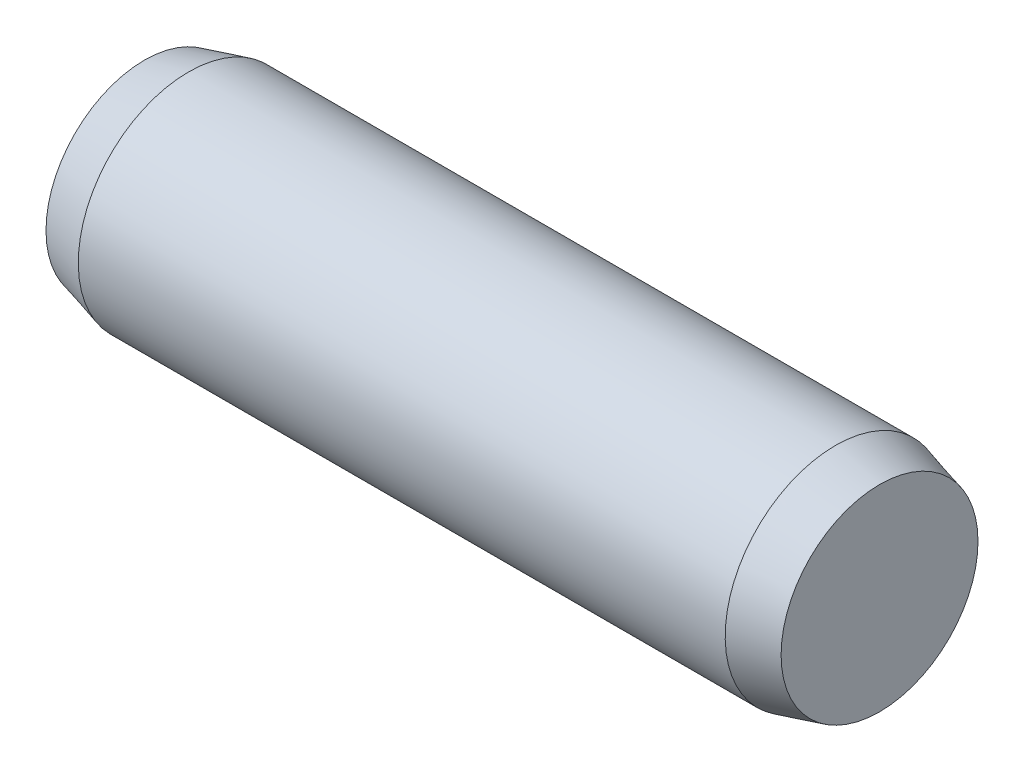
ISO-10303-21;
HEADER;
FILE_DESCRIPTION(('STEP AP214'),'2;1');
FILE_NAME('part.step','',(''),(''),'','','');
FILE_SCHEMA(('AUTOMOTIVE_DESIGN { 1 0 10303 214 1 1 1 1 }'));
ENDSEC;
DATA;
#1=APPLICATION_CONTEXT('core data for automotive mechanical design processes');
#2=APPLICATION_PROTOCOL_DEFINITION('international standard','automotive_design',2000,#1);
#3=PRODUCT_CONTEXT('',#1,'mechanical');
#4=PRODUCT('Part','Part','',(#3));
#5=PRODUCT_RELATED_PRODUCT_CATEGORY('part','',(#4));
#6=PRODUCT_DEFINITION_FORMATION('','',#4);
#7=PRODUCT_DEFINITION_CONTEXT('part definition',#1,'design');
#8=PRODUCT_DEFINITION('design','',#6,#7);
#9=PRODUCT_DEFINITION_SHAPE('','',#8);
#10=(LENGTH_UNIT() NAMED_UNIT(*) SI_UNIT(.MILLI.,.METRE.));
#11=(NAMED_UNIT(*) PLANE_ANGLE_UNIT() SI_UNIT($,.RADIAN.));
#12=(NAMED_UNIT(*) SI_UNIT($,.STERADIAN.) SOLID_ANGLE_UNIT());
#13=UNCERTAINTY_MEASURE_WITH_UNIT(LENGTH_MEASURE(1.E-05),#10,'distance_accuracy_value','');
#14=(GEOMETRIC_REPRESENTATION_CONTEXT(3) GLOBAL_UNCERTAINTY_ASSIGNED_CONTEXT((#13)) GLOBAL_UNIT_ASSIGNED_CONTEXT((#10,
#11,#12)) REPRESENTATION_CONTEXT('',''));
#15=CARTESIAN_POINT('',(0.,0.,0.));
#16=DIRECTION('',(0.,0.,1.));
#17=DIRECTION('',(1.,0.,0.));
#18=AXIS2_PLACEMENT_3D('',#15,#16,#17);
#19=CARTESIAN_POINT('',(0.,0.,0.));
#20=DIRECTION('',(-1.,0.,0.));
#21=DIRECTION('',(0.,-1.,0.));
#22=AXIS2_PLACEMENT_3D('',#19,#20,#21);
#23=PLANE('',#22);
#24=CARTESIAN_POINT('',(0.,0.,0.));
#25=DIRECTION('',(1.,0.,0.));
#26=DIRECTION('',(0.,1.,0.));
#27=AXIS2_PLACEMENT_3D('',#24,#25,#26);
#28=CIRCLE('',#27,0.267846096908265);
#29=CARTESIAN_POINT('',(0.,0.267846096908265,0.));
#30=VERTEX_POINT('',#29);
#31=EDGE_CURVE('E10',#30,#30,#28,.T.);
#32=ORIENTED_EDGE('',*,*,#31,.F.);
#33=EDGE_LOOP('',(#32));
#34=FACE_BOUND('',#33,.T.);
#35=ADVANCED_FACE('F27',(#34),#23,.T.);
#36=CARTESIAN_POINT('',(0.12,0.,0.));
#37=DIRECTION('',(1.,0.,0.));
#38=DIRECTION('',(0.,1.,0.));
#39=AXIS2_PLACEMENT_3D('',#36,#37,#38);
#40=CONICAL_SURFACE('',#39,0.3,0.26179938779915);
#41=ORIENTED_EDGE('',*,*,#31,.T.);
#42=EDGE_LOOP('',(#41));
#43=FACE_BOUND('',#42,.T.);
#44=CARTESIAN_POINT('',(0.12,0.,0.));
#45=DIRECTION('',(1.,0.,0.));
#46=DIRECTION('',(0.,1.,0.));
#47=AXIS2_PLACEMENT_3D('',#44,#45,#46);
#48=CIRCLE('',#47,0.3);
#49=CARTESIAN_POINT('',(0.12,0.3,0.));
#50=VERTEX_POINT('',#49);
#51=EDGE_CURVE('E33',#50,#50,#48,.T.);
#52=ORIENTED_EDGE('',*,*,#51,.F.);
#53=EDGE_LOOP('',(#52));
#54=FACE_BOUND('',#53,.T.);
#55=ADVANCED_FACE('F59',(#43,#54),#40,.T.);
#56=CARTESIAN_POINT('',(2.,0.,0.));
#57=DIRECTION('',(1.,0.,0.));
#58=DIRECTION('',(0.,1.,0.));
#59=AXIS2_PLACEMENT_3D('',#56,#57,#58);
#60=CYLINDRICAL_SURFACE('',#59,0.3);
#61=ORIENTED_EDGE('',*,*,#51,.T.);
#62=EDGE_LOOP('',(#61));
#63=FACE_BOUND('',#62,.T.);
#64=CARTESIAN_POINT('',(1.88,0.,0.));
#65=DIRECTION('',(1.,0.,0.));
#66=DIRECTION('',(0.,1.,0.));
#67=AXIS2_PLACEMENT_3D('',#64,#65,#66);
#68=CIRCLE('',#67,0.3);
#69=CARTESIAN_POINT('',(1.88,0.3,0.));
#70=VERTEX_POINT('',#69);
#71=EDGE_CURVE('E37',#70,#70,#68,.T.);
#72=ORIENTED_EDGE('',*,*,#71,.F.);
#73=EDGE_LOOP('',(#72));
#74=FACE_BOUND('',#73,.T.);
#75=ADVANCED_FACE('F51',(#63,#74),#60,.T.);
#76=CARTESIAN_POINT('',(2.,0.,0.));
#77=DIRECTION('',(-1.,0.,0.));
#78=DIRECTION('',(0.,-1.,0.));
#79=AXIS2_PLACEMENT_3D('',#76,#77,#78);
#80=CONICAL_SURFACE('',#79,0.267846096908265,0.26179938779915);
#81=ORIENTED_EDGE('',*,*,#71,.T.);
#82=EDGE_LOOP('',(#81));
#83=FACE_BOUND('',#82,.T.);
#84=CARTESIAN_POINT('',(2.,0.,0.));
#85=DIRECTION('',(1.,0.,0.));
#86=DIRECTION('',(0.,1.,0.));
#87=AXIS2_PLACEMENT_3D('',#84,#85,#86);
#88=CIRCLE('',#87,0.267846096908265);
#89=CARTESIAN_POINT('',(2.,0.267846096908265,0.));
#90=VERTEX_POINT('',#89);
#91=EDGE_CURVE('E41',#90,#90,#88,.T.);
#92=ORIENTED_EDGE('',*,*,#91,.F.);
#93=EDGE_LOOP('',(#92));
#94=FACE_BOUND('',#93,.T.);
#95=ADVANCED_FACE('F49',(#83,#94),#80,.T.);
#96=CARTESIAN_POINT('',(2.,0.267846096908265,0.));
#97=DIRECTION('',(1.,0.,0.));
#98=DIRECTION('',(0.,1.,0.));
#99=AXIS2_PLACEMENT_3D('',#96,#97,#98);
#100=PLANE('',#99);
#101=ORIENTED_EDGE('',*,*,#91,.T.);
#102=EDGE_LOOP('',(#101));
#103=FACE_BOUND('',#102,.T.);
#104=ADVANCED_FACE('F47',(#103),#100,.T.);
#105=CLOSED_SHELL('',(#35,#55,#75,#95,#104));
#106=MANIFOLD_SOLID_BREP('B2',#105);
#107=ADVANCED_BREP_SHAPE_REPRESENTATION('',(#18,#106),#14);
#108=SHAPE_DEFINITION_REPRESENTATION(#9,#107);
ENDSEC;
END-ISO-10303-21;
